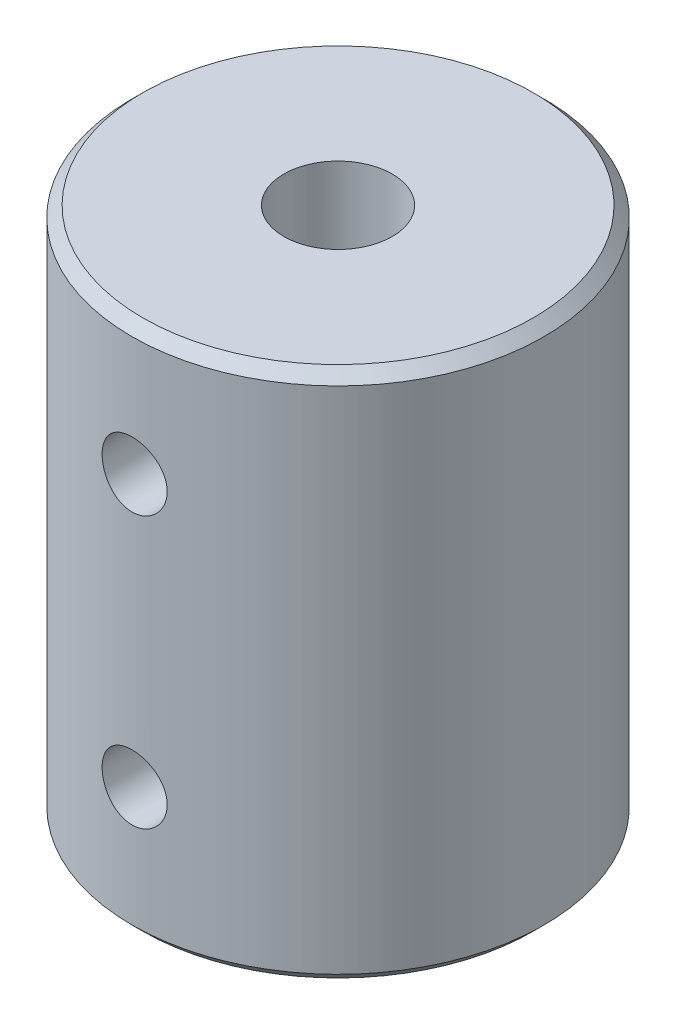
ISO-10303-21;
HEADER;
FILE_DESCRIPTION(('STEP AP214'),'2;1');
FILE_NAME('part.step','',(''),(''),'','','');
FILE_SCHEMA(('AUTOMOTIVE_DESIGN { 1 0 10303 214 1 1 1 1 }'));
ENDSEC;
DATA;
#1=APPLICATION_CONTEXT('core data for automotive mechanical design processes');
#2=APPLICATION_PROTOCOL_DEFINITION('international standard','automotive_design',2000,#1);
#3=PRODUCT_CONTEXT('',#1,'mechanical');
#4=PRODUCT('Part','Part','',(#3));
#5=PRODUCT_RELATED_PRODUCT_CATEGORY('part','',(#4));
#6=PRODUCT_DEFINITION_FORMATION('','',#4);
#7=PRODUCT_DEFINITION_CONTEXT('part definition',#1,'design');
#8=PRODUCT_DEFINITION('design','',#6,#7);
#9=PRODUCT_DEFINITION_SHAPE('','',#8);
#10=(LENGTH_UNIT() NAMED_UNIT(*) SI_UNIT(.MILLI.,.METRE.));
#11=(NAMED_UNIT(*) PLANE_ANGLE_UNIT() SI_UNIT($,.RADIAN.));
#12=(NAMED_UNIT(*) SI_UNIT($,.STERADIAN.) SOLID_ANGLE_UNIT());
#13=UNCERTAINTY_MEASURE_WITH_UNIT(LENGTH_MEASURE(1.E-05),#10,'distance_accuracy_value','');
#14=(GEOMETRIC_REPRESENTATION_CONTEXT(3) GLOBAL_UNCERTAINTY_ASSIGNED_CONTEXT((#13)) GLOBAL_UNIT_ASSIGNED_CONTEXT((#10,
#11,#12)) REPRESENTATION_CONTEXT('',''));
#15=CARTESIAN_POINT('',(0.,0.,0.));
#16=DIRECTION('',(0.,0.,1.));
#17=DIRECTION('',(1.,0.,0.));
#18=AXIS2_PLACEMENT_3D('',#15,#16,#17);
#19=CARTESIAN_POINT('',(0.,24.5,0.));
#20=DIRECTION('',(0.,-1.,0.));
#21=DIRECTION('',(0.,0.,-1.));
#22=AXIS2_PLACEMENT_3D('',#19,#20,#21);
#23=CYLINDRICAL_SURFACE('',#22,2.5);
#24=CARTESIAN_POINT('',(1.5,18.5,2.));
#25=CARTESIAN_POINT('',(1.50000404108592,18.4245210247104,1.99999416642511));
#26=CARTESIAN_POINT('',(1.49426852824014,18.3490615659202,2.00433633903481));
#27=CARTESIAN_POINT('',(1.47174965152787,18.2006760960378,2.02092590613883));
#28=CARTESIAN_POINT('',(1.45495475788936,18.1277528126149,2.03318155043097));
#29=CARTESIAN_POINT('',(1.41143486335796,17.9869163583227,2.0636233903473));
#30=CARTESIAN_POINT('',(1.3847815450315,17.9189711619647,2.08176666183119));
#31=CARTESIAN_POINT('',(1.3225290928302,17.7885625466321,2.12185904995836));
#32=CARTESIAN_POINT('',(1.28692729054694,17.7261007703049,2.14380930122416));
#33=CARTESIAN_POINT('',(1.20271292747644,17.6000509833359,2.19228594587542));
#34=CARTESIAN_POINT('',(1.15304179435289,17.5372590428761,2.21904371037662));
#35=CARTESIAN_POINT('',(1.04426801309985,17.4202352372583,2.27226229431061));
#36=CARTESIAN_POINT('',(0.985158296729613,17.3660098483292,2.29872287517103));
#37=CARTESIAN_POINT('',(0.851442367411701,17.2618661902903,2.35175567858734));
#38=CARTESIAN_POINT('',(0.775851995162548,17.2130455363302,2.37803133577818));
#39=CARTESIAN_POINT('',(0.615654228271659,17.1291902775556,2.42443786983179));
#40=CARTESIAN_POINT('',(0.531055196626331,17.0941430258773,2.44457437988735));
#41=CARTESIAN_POINT('',(0.363771406742667,17.0424040771874,2.4747098780044));
#42=CARTESIAN_POINT('',(0.281674698130916,17.0242796390327,2.4854930393917));
#43=CARTESIAN_POINT('',(0.11497050938271,17.0020571971369,2.49874939277545));
#44=CARTESIAN_POINT('',(0.0303654624001549,16.997946022,2.50123038813307));
#45=CARTESIAN_POINT('',(-0.127637283737309,17.0036137473425,2.49783372711539));
#46=CARTESIAN_POINT('',(-0.201123832865634,17.0117335261693,2.49295437513726));
#47=CARTESIAN_POINT('',(-0.345464269151767,17.0384797956481,2.47707997553857));
#48=CARTESIAN_POINT('',(-0.416317961051201,17.0571070639072,2.46608447529309));
#49=CARTESIAN_POINT('',(-0.554056780469079,17.1041655627038,2.43884907201719));
#50=CARTESIAN_POINT('',(-0.620916491037617,17.132653061139,2.42257910450824));
#51=CARTESIAN_POINT('',(-0.748988660115611,17.1983846162255,2.38609637638748));
#52=CARTESIAN_POINT('',(-0.810199646208011,17.235630947059,2.36588259201812));
#53=CARTESIAN_POINT('',(-0.933074267143199,17.3228390928045,2.32037925976363));
#54=CARTESIAN_POINT('',(-0.993918663198193,17.3737883117357,2.2947718295215));
#55=CARTESIAN_POINT('',(-1.10671465909275,17.4844041178602,2.24255554245601));
#56=CARTESIAN_POINT('',(-1.1586540130834,17.5440825034745,2.21594536703375));
#57=CARTESIAN_POINT('',(-1.25824837767417,17.6786534061636,2.16111075123946));
#58=CARTESIAN_POINT('',(-1.30470933188632,17.7545075765395,2.13305661385124));
#59=CARTESIAN_POINT('',(-1.38397217194232,17.9147062316366,2.08250879557267));
#60=CARTESIAN_POINT('',(-1.41679921962189,17.9990347161256,2.0600049029882));
#61=CARTESIAN_POINT('',(-1.46077497064842,18.1523936318954,2.02895865196731));
#62=CARTESIAN_POINT('',(-1.47527903312665,18.2200406322966,2.01833888618316));
#63=CARTESIAN_POINT('',(-1.49480872755284,18.3573736102995,2.00392150777558));
#64=CARTESIAN_POINT('',(-1.49984538302907,18.4270571204846,2.00011596115116));
#65=CARTESIAN_POINT('',(-1.50014781114183,18.5665516824357,1.99988914321323));
#66=CARTESIAN_POINT('',(-1.49540004697659,18.6363627772152,2.00347810223984));
#67=CARTESIAN_POINT('',(-1.47640290574941,18.7739873437486,2.01751520788652));
#68=CARTESIAN_POINT('',(-1.46214601830139,18.8417991922403,2.02796877613213));
#69=CARTESIAN_POINT('',(-1.42488312618657,18.9737145794798,2.054317683331));
#70=CARTESIAN_POINT('',(-1.40188805257362,19.0378226365322,2.07020622092812));
#71=CARTESIAN_POINT('',(-1.34796261057072,19.1614777157302,2.10571539417587));
#72=CARTESIAN_POINT('',(-1.31702924888212,19.221023006366,2.12533743689999));
#73=CARTESIAN_POINT('',(-1.24167439558512,19.3452400825123,2.17036819177737));
#74=CARTESIAN_POINT('',(-1.19582663060302,19.4089008350966,2.19618239397369));
#75=CARTESIAN_POINT('',(-1.094873955187,19.5282854848495,2.24821754803621));
#76=CARTESIAN_POINT('',(-1.03976018672402,19.5840016921691,2.27443886711455));
#77=CARTESIAN_POINT('',(-0.913274837212761,19.6932240073504,2.32835625910913));
#78=CARTESIAN_POINT('',(-0.840721108780185,19.7455007266058,2.3558007587587));
#79=CARTESIAN_POINT('',(-0.686103100868014,19.8369027768367,2.40537639133459));
#80=CARTESIAN_POINT('',(-0.604045176134696,19.8760368278409,2.42751104449411));
#81=CARTESIAN_POINT('',(-0.438840232972132,19.9368682034314,2.46252280092775));
#82=CARTESIAN_POINT('',(-0.356205963651251,19.9596262277911,2.47595588067329));
#83=CARTESIAN_POINT('',(-0.18738306389085,19.9907146028463,2.494407389061));
#84=CARTESIAN_POINT('',(-0.101198571781962,19.9990612907176,2.49943534582737));
#85=CARTESIAN_POINT('',(0.0598120232009908,20.0006746085859,2.50040600461976));
#86=CARTESIAN_POINT('',(0.134620583589713,19.995803334563,2.49747057186327));
#87=CARTESIAN_POINT('',(0.28214875597878,19.9751061756184,2.48512948412095));
#88=CARTESIAN_POINT('',(0.35486834470192,19.9592801686784,2.47572375706639));
#89=CARTESIAN_POINT('',(0.495145481978802,19.9177804284162,2.45149427526962));
#90=CARTESIAN_POINT('',(0.562767032608834,19.8922684038708,2.43675966858906));
#91=CARTESIAN_POINT('',(0.692781971999988,19.8323594054452,2.40303337447155));
#92=CARTESIAN_POINT('',(0.755174184199837,19.7979604391404,2.38404073252268));
#93=CARTESIAN_POINT('',(0.880263645295952,19.7170748034312,2.3409343265938));
#94=CARTESIAN_POINT('',(0.942258690439945,19.6696812909831,2.31648844639149));
#95=CARTESIAN_POINT('',(1.05789751536307,19.5662469662823,2.26601907350661));
#96=CARTESIAN_POINT('',(1.11153190956916,19.5101965743921,2.23999385274509));
#97=CARTESIAN_POINT('',(1.2159097535057,19.3827144378223,2.18528165666204));
#98=CARTESIAN_POINT('',(1.26542406663368,19.3102335138345,2.15667566270901));
#99=CARTESIAN_POINT('',(1.35156817210325,19.1565151472335,2.10376464485145));
#100=CARTESIAN_POINT('',(1.38820466322661,19.0752822860186,2.07945738811052));
#101=CARTESIAN_POINT('',(1.44437116535132,18.9129357148628,2.0408000304796));
#102=CARTESIAN_POINT('',(1.46509526060188,18.8324047640388,2.02577665830138));
#103=CARTESIAN_POINT('',(1.49289268240426,18.6679026052963,2.00539032320036));
#104=CARTESIAN_POINT('',(1.49999550595837,18.5839392342413,2.00000648744643));
#105=CARTESIAN_POINT('',(1.5,18.5,2.));
#106=B_SPLINE_CURVE_WITH_KNOTS('',3,(#24,#25,#26,#27,#28,#29,#30,#31,#32,#33,#34,#35,#36,#37,
#38,#39,#40,#41,#42,#43,#44,#45,#46,#47,#48,#49,#50,#51,#52,#53,#54,#55,#56,#57,#58,#59,#60,#61,
#62,#63,#64,#65,#66,#67,#68,#69,#70,#71,#72,#73,#74,#75,#76,#77,#78,#79,#80,#81,#82,#83,#84,#85,
#86,#87,#88,#89,#90,#91,#92,#93,#94,#95,#96,#97,#98,#99,#100,#101,#102,#103,#104,#105),
.UNSPECIFIED.,.T.,.F.,(4,2,2,2,2,2,2,2,2,2,2,2,2,2,2,2,2,2,2,2,2,2,2,2,2,2,2,2,2,2,2,2,2,2,2,2,
2,2,2,2,4),(0.,0.226085249493394,0.452406574330771,0.677113624991876,0.90188776221593,
1.15414462390001,1.40659128601844,1.68630157736223,1.9657544327122,2.21853330858497,
2.47107452602766,2.69230130543182,2.91354445887944,3.13607155036377,3.35865648368878,
3.60782810055849,3.85733966656908,4.13576671140277,4.41367760154768,4.62276298054684,
4.83160475643977,5.04073566011181,5.25003193304128,5.45906724365495,5.66818149154662,
5.91499438482003,6.16204457978455,6.44121828011589,6.72020638384848,6.97891479383338,
7.23732973022727,7.461293218494,7.68525920139649,7.90563970188756,8.12606965394585,
8.37042963549488,8.61506198741956,8.89071695766604,9.16622832484806,9.41820120134355,
9.66962780912277),.UNSPECIFIED.);
#107=CARTESIAN_POINT('',(1.5,18.5,2.));
#108=VERTEX_POINT('',#107);
#109=EDGE_CURVE('E71',#108,#108,#106,.T.);
#110=ORIENTED_EDGE('',*,*,#109,.F.);
#111=EDGE_LOOP('',(#110));
#112=FACE_BOUND('',#111,.T.);
#113=CARTESIAN_POINT('',(0.,24.5,0.));
#114=DIRECTION('',(0.,1.,0.));
#115=DIRECTION('',(0.,0.,1.));
#116=AXIS2_PLACEMENT_3D('',#113,#114,#115);
#117=CIRCLE('',#116,2.5);
#118=CARTESIAN_POINT('',(0.,24.5,2.5));
#119=VERTEX_POINT('',#118);
#120=EDGE_CURVE('E61',#119,#119,#117,.T.);
#121=ORIENTED_EDGE('',*,*,#120,.T.);
#122=EDGE_LOOP('',(#121));
#123=FACE_BOUND('',#122,.T.);
#124=CARTESIAN_POINT('',(0.,10.,0.));
#125=DIRECTION('',(0.,-1.,0.));
#126=DIRECTION('',(0.,0.,-1.));
#127=AXIS2_PLACEMENT_3D('',#124,#125,#126);
#128=CIRCLE('',#127,2.5);
#129=CARTESIAN_POINT('',(0.,10.,-2.5));
#130=VERTEX_POINT('',#129);
#131=EDGE_CURVE('E59',#130,#130,#128,.T.);
#132=ORIENTED_EDGE('',*,*,#131,.T.);
#133=EDGE_LOOP('',(#132));
#134=FACE_BOUND('',#133,.T.);
#135=ADVANCED_FACE('F34',(#112,#123,#134),#23,.F.);
#136=CARTESIAN_POINT('',(0.,24.5,0.));
#137=DIRECTION('',(0.,1.,0.));
#138=DIRECTION('',(0.,0.,1.));
#139=AXIS2_PLACEMENT_3D('',#136,#137,#138);
#140=PLANE('',#139);
#141=CARTESIAN_POINT('',(0.,24.5,0.));
#142=DIRECTION('',(0.,1.,0.));
#143=DIRECTION('',(0.,0.,1.));
#144=AXIS2_PLACEMENT_3D('',#141,#142,#143);
#145=CIRCLE('',#144,9.);
#146=CARTESIAN_POINT('',(0.,24.5,9.));
#147=VERTEX_POINT('',#146);
#148=EDGE_CURVE('E46',#147,#147,#145,.T.);
#149=ORIENTED_EDGE('',*,*,#148,.T.);
#150=EDGE_LOOP('',(#149));
#151=FACE_BOUND('',#150,.T.);
#152=ORIENTED_EDGE('',*,*,#120,.F.);
#153=EDGE_LOOP('',(#152));
#154=FACE_BOUND('',#153,.T.);
#155=ADVANCED_FACE('F113',(#151,#154),#140,.T.);
#156=CARTESIAN_POINT('',(0.,0.,0.));
#157=DIRECTION('',(0.,1.,0.));
#158=DIRECTION('',(0.,0.,1.));
#159=AXIS2_PLACEMENT_3D('',#156,#157,#158);
#160=PLANE('',#159);
#161=CARTESIAN_POINT('',(0.,0.,0.));
#162=DIRECTION('',(0.,-1.,0.));
#163=DIRECTION('',(0.,0.,-1.));
#164=AXIS2_PLACEMENT_3D('',#161,#162,#163);
#165=CIRCLE('',#164,4.);
#166=CARTESIAN_POINT('',(0.,0.,-4.));
#167=VERTEX_POINT('',#166);
#168=EDGE_CURVE('E91',#167,#167,#165,.T.);
#169=ORIENTED_EDGE('',*,*,#168,.F.);
#170=EDGE_LOOP('',(#169));
#171=FACE_BOUND('',#170,.T.);
#172=CARTESIAN_POINT('',(0.,0.,0.));
#173=DIRECTION('',(0.,1.,0.));
#174=DIRECTION('',(0.,0.,1.));
#175=AXIS2_PLACEMENT_3D('',#172,#173,#174);
#176=CIRCLE('',#175,8.99999999999999);
#177=CARTESIAN_POINT('',(0.,0.,8.99999999999999));
#178=VERTEX_POINT('',#177);
#179=EDGE_CURVE('E50',#178,#178,#176,.F.);
#180=ORIENTED_EDGE('',*,*,#179,.T.);
#181=EDGE_LOOP('',(#180));
#182=FACE_BOUND('',#181,.T.);
#183=ADVANCED_FACE('F101',(#171,#182),#160,.F.);
#184=CARTESIAN_POINT('',(0.,24.5,0.));
#185=DIRECTION('',(0.,-1.,0.));
#186=DIRECTION('',(0.,0.,-1.));
#187=AXIS2_PLACEMENT_3D('',#184,#185,#186);
#188=CYLINDRICAL_SURFACE('',#187,9.5);
#189=CARTESIAN_POINT('',(1.5,18.5,9.38083151964686));
#190=CARTESIAN_POINT('',(1.49999658455056,18.416309730994,9.38083297404066));
#191=CARTESIAN_POINT('',(1.49297223784084,18.3325722057604,9.38196360092028));
#192=CARTESIAN_POINT('',(1.46507009131938,18.1674421963071,9.38636039550341));
#193=CARTESIAN_POINT('',(1.44417911871311,18.0860520187703,9.38962859377943));
#194=CARTESIAN_POINT('',(1.38918760267279,17.9280306268152,9.39792135372632));
#195=CARTESIAN_POINT('',(1.35509761216466,17.8513956671386,9.40294451195283));
#196=CARTESIAN_POINT('',(1.27470128030859,17.7049430897645,9.414179545352));
#197=CARTESIAN_POINT('',(1.22839647880733,17.6351246142734,9.42039127066217));
#198=CARTESIAN_POINT('',(1.12444713836387,17.5036587559128,9.43336503838525));
#199=CARTESIAN_POINT('',(1.06671563821398,17.4420805156865,9.44013105201471));
#200=CARTESIAN_POINT('',(0.941739545888725,17.3294429254274,9.45341567106039));
#201=CARTESIAN_POINT('',(0.874494412511281,17.2783841742228,9.45993426237471));
#202=CARTESIAN_POINT('',(0.731954548292167,17.1879777440354,9.47203134599669));
#203=CARTESIAN_POINT('',(0.656618750818363,17.1486940570074,9.47760463238817));
#204=CARTESIAN_POINT('',(0.500315336961976,17.0833638343747,9.48713906529767));
#205=CARTESIAN_POINT('',(0.419348049999348,17.0573165252332,9.49110030602129));
#206=CARTESIAN_POINT('',(0.254793214503935,17.0194089321868,9.49693629805995));
#207=CARTESIAN_POINT('',(0.171232996932505,17.0074326731839,9.4988280968723));
#208=CARTESIAN_POINT('',(0.00326909893889466,16.9976467905348,9.5003705446193));
#209=CARTESIAN_POINT('',(-0.0811345294603269,16.999836298441,9.50002133094164));
#210=CARTESIAN_POINT('',(-0.247597304848638,17.0182287718207,9.49713466336618));
#211=CARTESIAN_POINT('',(-0.329670625893897,17.0343069477594,9.49461669627846));
#212=CARTESIAN_POINT('',(-0.489939598315296,17.0798241916706,9.48769715323518));
#213=CARTESIAN_POINT('',(-0.568135141212462,17.1092636331844,9.48329552461823));
#214=CARTESIAN_POINT('',(-0.718803540216119,17.1807937561529,9.47306987014884));
#215=CARTESIAN_POINT('',(-0.791251288178856,17.2229364571255,9.46724001448607));
#216=CARTESIAN_POINT('',(-0.928093849593963,17.3186387835267,9.45480671150477));
#217=CARTESIAN_POINT('',(-0.992488076174234,17.372199240216,9.44820320787719));
#218=CARTESIAN_POINT('',(-1.1121320674923,17.489910476114,9.43487320037046));
#219=CARTESIAN_POINT('',(-1.16727457805414,17.5541702627698,9.42814614020981));
#220=CARTESIAN_POINT('',(-1.26601092962899,17.6910871241671,9.41539709463342));
#221=CARTESIAN_POINT('',(-1.30960468415935,17.7637442617862,9.40937511449785));
#222=CARTESIAN_POINT('',(-1.38402357522716,17.9155109464371,9.39871800561222));
#223=CARTESIAN_POINT('',(-1.41483681797789,17.9946264221589,9.3940841698043));
#224=CARTESIAN_POINT('',(-1.46270749784294,18.1569994205907,9.38675017598398));
#225=CARTESIAN_POINT('',(-1.47976601505946,18.2402566175231,9.38404986614158));
#226=CARTESIAN_POINT('',(-1.49949411042943,18.4075929556588,9.38091773533559));
#227=CARTESIAN_POINT('',(-1.50231612080203,18.4916536912182,9.38046188392375));
#228=CARTESIAN_POINT('',(-1.4938963689811,18.659047058933,9.38180638869071));
#229=CARTESIAN_POINT('',(-1.48265509215639,18.7423797161168,9.38360666700331));
#230=CARTESIAN_POINT('',(-1.44655746438407,18.9054736693627,9.38923845197488));
#231=CARTESIAN_POINT('',(-1.42177781446732,18.9852523717135,9.39305851175888));
#232=CARTESIAN_POINT('',(-1.35938693205191,19.1395243407161,9.40228991972539));
#233=CARTESIAN_POINT('',(-1.3217750034913,19.2140173203894,9.40770135422673));
#234=CARTESIAN_POINT('',(-1.23442398163625,19.356284315317,9.41956203589073));
#235=CARTESIAN_POINT('',(-1.18458667109844,19.4239973256054,9.42601953670219));
#236=CARTESIAN_POINT('',(-1.07433532022963,19.5501534885926,9.43922022959441));
#237=CARTESIAN_POINT('',(-1.01392061491125,19.60859605803,9.44596343961713));
#238=CARTESIAN_POINT('',(-0.883556250112782,19.7151040379333,9.45905128553892));
#239=CARTESIAN_POINT('',(-0.813523322567932,19.7630681337632,9.46539164279549));
#240=CARTESIAN_POINT('',(-0.666305394879822,19.8465500312293,9.47689193046182));
#241=CARTESIAN_POINT('',(-0.589120607345014,19.8820682027044,9.48205189594613));
#242=CARTESIAN_POINT('',(-0.430099180755798,19.939490080176,9.49059133505206));
#243=CARTESIAN_POINT('',(-0.348282544696114,19.9614480818955,9.49397790107197));
#244=CARTESIAN_POINT('',(-0.182065541000525,19.9913016379704,9.49861883842448));
#245=CARTESIAN_POINT('',(-0.097665363749637,19.9991982260071,9.49987336648691));
#246=CARTESIAN_POINT('',(0.070342489056164,20.0006774861194,9.50010700904781));
#247=CARTESIAN_POINT('',(0.15394880985568,19.9944147738016,9.49911070212592));
#248=CARTESIAN_POINT('',(0.318903288593767,19.968086009826,9.49500446266303));
#249=CARTESIAN_POINT('',(0.400251456141505,19.9480200169149,9.4918945391176));
#250=CARTESIAN_POINT('',(0.558330315524414,19.8947112386408,9.48390902705529));
#251=CARTESIAN_POINT('',(0.635065084473798,19.8614802910505,9.47903502511627));
#252=CARTESIAN_POINT('',(0.781893871437118,19.7828017130742,9.46805518209959));
#253=CARTESIAN_POINT('',(0.851987627392474,19.7373536008625,9.46194929244058));
#254=CARTESIAN_POINT('',(0.984326499290175,19.6349767236385,9.44910438099924));
#255=CARTESIAN_POINT('',(1.04648306132952,19.5779342156682,9.44235947063351));
#256=CARTESIAN_POINT('',(1.16039729972464,19.4542269669354,9.42903896923987));
#257=CARTESIAN_POINT('',(1.21215253557012,19.387559974227,9.42246341826431));
#258=CARTESIAN_POINT('',(1.30409009743287,19.2460015685181,9.41018172735959));
#259=CARTESIAN_POINT('',(1.34419772972858,19.171061150686,9.40448130469082));
#260=CARTESIAN_POINT('',(1.41119529560835,19.0154502477483,9.39466254048804));
#261=CARTESIAN_POINT('',(1.43809871074204,18.934785703743,9.39054258623338));
#262=CARTESIAN_POINT('',(1.47193913254666,18.7948171282112,9.38528558640041));
#263=CARTESIAN_POINT('',(1.48244550005068,18.7363700340157,9.38362436450214));
#264=CARTESIAN_POINT('',(1.49647709113171,18.6186231993665,9.38139682399235));
#265=CARTESIAN_POINT('',(1.50000242102603,18.5593234719117,9.38083048870633));
#266=CARTESIAN_POINT('',(1.5,18.5,9.38083151964686));
#267=B_SPLINE_CURVE_WITH_KNOTS('',3,(#189,#190,#191,#192,#193,#194,#195,#196,#197,#198,#199,
#200,#201,#202,#203,#204,#205,#206,#207,#208,#209,#210,#211,#212,#213,#214,#215,#216,#217,#218,
#219,#220,#221,#222,#223,#224,#225,#226,#227,#228,#229,#230,#231,#232,#233,#234,#235,#236,#237,
#238,#239,#240,#241,#242,#243,#244,#245,#246,#247,#248,#249,#250,#251,#252,#253,#254,#255,#256,
#257,#258,#259,#260,#261,#262,#263,#264,#265,#266),.UNSPECIFIED.,.T.,.F.,(4,2,2,2,2,2,2,2,2,2,2,
2,2,2,2,2,2,2,2,2,2,2,2,2,2,2,2,2,2,2,2,2,2,2,2,2,2,2,4),(0.,0.250853927262165,
0.501946498416266,0.752838728320958,1.00369934487581,1.2565480788977,1.50941120251429,
1.76362459165416,2.01782312279828,2.26991148848838,2.52198439977627,2.77181572176523,
3.02165402872708,3.27252964579772,3.52342353390932,3.77705047333307,4.03067931198404,
4.28454365571369,4.53838806257511,4.78950866646251,5.04062060361752,5.29032441173719,
5.54004176670728,5.79183509438419,6.04364425767606,6.29778980620821,6.55192780199649,
6.8050415020287,7.05813659442521,7.30848132386849,7.55882498785123,7.80894405482681,
8.05907298755212,8.31178569360907,8.56455762574338,8.81891644248641,9.07301501496295,
9.25083440456604,9.42865108605878),.UNSPECIFIED.);
#268=CARTESIAN_POINT('',(1.5,18.5,9.38083151964686));
#269=VERTEX_POINT('',#268);
#270=EDGE_CURVE('E10',#269,#269,#267,.T.);
#271=ORIENTED_EDGE('',*,*,#270,.T.);
#272=EDGE_LOOP('',(#271));
#273=FACE_BOUND('',#272,.T.);
#274=CARTESIAN_POINT('',(1.5,6.,9.38083151964686));
#275=CARTESIAN_POINT('',(1.49999658455055,5.91630973099397,9.38083297404066));
#276=CARTESIAN_POINT('',(1.49297223784084,5.83257220576043,9.38196360092028));
#277=CARTESIAN_POINT('',(1.46507009131938,5.66744219630707,9.38636039550341));
#278=CARTESIAN_POINT('',(1.44417911871311,5.58605201877025,9.38962859377943));
#279=CARTESIAN_POINT('',(1.38918760267279,5.42803062681524,9.39792135372632));
#280=CARTESIAN_POINT('',(1.35509761216466,5.35139566713862,9.40294451195283));
#281=CARTESIAN_POINT('',(1.27470128030859,5.20494308976448,9.414179545352));
#282=CARTESIAN_POINT('',(1.22839647880733,5.13512461427336,9.42039127066217));
#283=CARTESIAN_POINT('',(1.12444713836387,5.00365875591277,9.43336503838525));
#284=CARTESIAN_POINT('',(1.06671563821398,4.94208051568652,9.44013105201471));
#285=CARTESIAN_POINT('',(0.941739545888722,4.82944292542735,9.45341567106039));
#286=CARTESIAN_POINT('',(0.874494412511277,4.7783841742228,9.45993426237471));
#287=CARTESIAN_POINT('',(0.731954548292163,4.68797774403544,9.47203134599669));
#288=CARTESIAN_POINT('',(0.656618750818359,4.6486940570074,9.47760463238817));
#289=CARTESIAN_POINT('',(0.500315336961972,4.58336383437469,9.48713906529767));
#290=CARTESIAN_POINT('',(0.419348049999344,4.55731652523315,9.49110030602129));
#291=CARTESIAN_POINT('',(0.254793214503931,4.51940893218676,9.49693629805995));
#292=CARTESIAN_POINT('',(0.171232996932501,4.50743267318387,9.4988280968723));
#293=CARTESIAN_POINT('',(0.00326909893889123,4.49764679053478,9.5003705446193));
#294=CARTESIAN_POINT('',(-0.0811345294603304,4.499836298441,9.50002133094164));
#295=CARTESIAN_POINT('',(-0.247597304848641,4.51822877182066,9.49713466336618));
#296=CARTESIAN_POINT('',(-0.329670625893899,4.53430694775938,9.49461669627846));
#297=CARTESIAN_POINT('',(-0.489939598315299,4.57982419167056,9.48769715323518));
#298=CARTESIAN_POINT('',(-0.568135141212465,4.60926363318438,9.48329552461823));
#299=CARTESIAN_POINT('',(-0.718803540216121,4.68079375615291,9.47306987014884));
#300=CARTESIAN_POINT('',(-0.791251288178858,4.72293645712551,9.46724001448607));
#301=CARTESIAN_POINT('',(-0.928093849593965,4.81863878352674,9.45480671150477));
#302=CARTESIAN_POINT('',(-0.992488076174237,4.87219924021597,9.44820320787719));
#303=CARTESIAN_POINT('',(-1.1121320674923,4.98991047611401,9.43487320037046));
#304=CARTESIAN_POINT('',(-1.16727457805414,5.05417026276977,9.42814614020981));
#305=CARTESIAN_POINT('',(-1.266010929629,5.1910871241671,9.41539709463342));
#306=CARTESIAN_POINT('',(-1.30960468415935,5.26374426178624,9.40937511449785));
#307=CARTESIAN_POINT('',(-1.38402357522716,5.41551094643708,9.39871800561222));
#308=CARTESIAN_POINT('',(-1.4148368179779,5.49462642215888,9.39408416980429));
#309=CARTESIAN_POINT('',(-1.46270749784294,5.65699942059069,9.38675017598398));
#310=CARTESIAN_POINT('',(-1.47976601505946,5.74025661752309,9.38404986614158));
#311=CARTESIAN_POINT('',(-1.49949411042943,5.90759295565885,9.38091773533559));
#312=CARTESIAN_POINT('',(-1.50231612080203,5.99165369121824,9.38046188392375));
#313=CARTESIAN_POINT('',(-1.4938963689811,6.15904705893304,9.38180638869071));
#314=CARTESIAN_POINT('',(-1.48265509215639,6.2423797161168,9.3836066670033));
#315=CARTESIAN_POINT('',(-1.44655746438407,6.40547366936269,9.38923845197488));
#316=CARTESIAN_POINT('',(-1.42177781446732,6.48525237171346,9.39305851175888));
#317=CARTESIAN_POINT('',(-1.35938693205191,6.63952434071612,9.4022899197254));
#318=CARTESIAN_POINT('',(-1.3217750034913,6.71401732038944,9.40770135422673));
#319=CARTESIAN_POINT('',(-1.23442398163625,6.85628431531696,9.41956203589073));
#320=CARTESIAN_POINT('',(-1.18458667109844,6.92399732560537,9.42601953670219));
#321=CARTESIAN_POINT('',(-1.07433532022963,7.05015348859258,9.43922022959441));
#322=CARTESIAN_POINT('',(-1.01392061491125,7.10859605802998,9.44596343961713));
#323=CARTESIAN_POINT('',(-0.883556250112781,7.21510403793332,9.45905128553892));
#324=CARTESIAN_POINT('',(-0.81352332256793,7.26306813376324,9.46539164279549));
#325=CARTESIAN_POINT('',(-0.666305394879819,7.34655003122935,9.47689193046182));
#326=CARTESIAN_POINT('',(-0.58912060734501,7.38206820270442,9.48205189594613));
#327=CARTESIAN_POINT('',(-0.430099180755794,7.43949008017602,9.49059133505206));
#328=CARTESIAN_POINT('',(-0.34828254469611,7.46144808189547,9.49397790107197));
#329=CARTESIAN_POINT('',(-0.182065541000522,7.49130163797043,9.49861883842448));
#330=CARTESIAN_POINT('',(-0.0976653637496341,7.4991982260071,9.49987336648691));
#331=CARTESIAN_POINT('',(0.0703424890561666,7.50067748611935,9.50010700904781));
#332=CARTESIAN_POINT('',(0.153948809855683,7.49441477380159,9.49911070212592));
#333=CARTESIAN_POINT('',(0.31890328859377,7.468086009826,9.49500446266303));
#334=CARTESIAN_POINT('',(0.400251456141508,7.44802001691492,9.4918945391176));
#335=CARTESIAN_POINT('',(0.558330315524417,7.39471123864075,9.48390902705529));
#336=CARTESIAN_POINT('',(0.6350650844738,7.36148029105045,9.47903502511627));
#337=CARTESIAN_POINT('',(0.78189387143712,7.28280171307417,9.46805518209959));
#338=CARTESIAN_POINT('',(0.851987627392476,7.23735360086246,9.46194929244058));
#339=CARTESIAN_POINT('',(0.984326499290177,7.13497672363849,9.44910438099924));
#340=CARTESIAN_POINT('',(1.04648306132953,7.07793421566818,9.44235947063351));
#341=CARTESIAN_POINT('',(1.16039729972464,6.95422696693538,9.42903896923987));
#342=CARTESIAN_POINT('',(1.21215253557012,6.887559974227,9.42246341826431));
#343=CARTESIAN_POINT('',(1.30409009743288,6.74600156851814,9.41018172735959));
#344=CARTESIAN_POINT('',(1.34419772972858,6.67106115068598,9.40448130469082));
#345=CARTESIAN_POINT('',(1.41119529560835,6.51545024774828,9.39466254048804));
#346=CARTESIAN_POINT('',(1.43809871074204,6.43478570374299,9.39054258623338));
#347=CARTESIAN_POINT('',(1.47193913254666,6.29481712821115,9.38528558640041));
#348=CARTESIAN_POINT('',(1.48244550005068,6.23637003401573,9.38362436450214));
#349=CARTESIAN_POINT('',(1.49647709113171,6.11862319936654,9.38139682399235));
#350=CARTESIAN_POINT('',(1.50000242102602,6.05932347191174,9.38083048870633));
#351=CARTESIAN_POINT('',(1.5,6.,9.38083151964686));
#352=B_SPLINE_CURVE_WITH_KNOTS('',3,(#274,#275,#276,#277,#278,#279,#280,#281,#282,#283,#284,
#285,#286,#287,#288,#289,#290,#291,#292,#293,#294,#295,#296,#297,#298,#299,#300,#301,#302,#303,
#304,#305,#306,#307,#308,#309,#310,#311,#312,#313,#314,#315,#316,#317,#318,#319,#320,#321,#322,
#323,#324,#325,#326,#327,#328,#329,#330,#331,#332,#333,#334,#335,#336,#337,#338,#339,#340,#341,
#342,#343,#344,#345,#346,#347,#348,#349,#350,#351),.UNSPECIFIED.,.T.,.F.,(4,2,2,2,2,2,2,2,2,2,2,
2,2,2,2,2,2,2,2,2,2,2,2,2,2,2,2,2,2,2,2,2,2,2,2,2,2,2,4),(0.,0.250853927262166,
0.501946498416268,0.752838728320958,1.00369934487581,1.2565480788977,1.50941120251429,
1.76362459165417,2.01782312279828,2.26991148848838,2.52198439977627,2.77181572176523,
3.02165402872708,3.27252964579772,3.52342353390932,3.77705047333307,4.03067931198404,
4.2845436557137,4.53838806257511,4.78950866646251,5.04062060361752,5.29032441173719,
5.54004176670728,5.79183509438419,6.04364425767606,6.29778980620821,6.55192780199649,
6.8050415020287,7.05813659442521,7.30848132386849,7.55882498785123,7.80894405482681,
8.05907298755212,8.31178569360908,8.56455762574338,8.81891644248641,9.07301501496295,
9.25083440456604,9.42865108605878),.UNSPECIFIED.);
#353=CARTESIAN_POINT('',(1.5,6.,9.38083151964686));
#354=VERTEX_POINT('',#353);
#355=EDGE_CURVE('E70',#354,#354,#352,.T.);
#356=ORIENTED_EDGE('',*,*,#355,.T.);
#357=EDGE_LOOP('',(#356));
#358=FACE_BOUND('',#357,.T.);
#359=CARTESIAN_POINT('',(0.,0.5,0.));
#360=DIRECTION('',(0.,1.,0.));
#361=DIRECTION('',(0.,0.,1.));
#362=AXIS2_PLACEMENT_3D('',#359,#360,#361);
#363=CIRCLE('',#362,9.5);
#364=CARTESIAN_POINT('',(0.,0.5,9.5));
#365=VERTEX_POINT('',#364);
#366=EDGE_CURVE('E55',#365,#365,#363,.T.);
#367=ORIENTED_EDGE('',*,*,#366,.T.);
#368=EDGE_LOOP('',(#367));
#369=FACE_BOUND('',#368,.T.);
#370=CARTESIAN_POINT('',(0.,24.,0.));
#371=DIRECTION('',(0.,1.,0.));
#372=DIRECTION('',(0.,0.,1.));
#373=AXIS2_PLACEMENT_3D('',#370,#371,#372);
#374=CIRCLE('',#373,9.5);
#375=CARTESIAN_POINT('',(0.,24.,9.5));
#376=VERTEX_POINT('',#375);
#377=EDGE_CURVE('E137',#376,#376,#374,.F.);
#378=ORIENTED_EDGE('',*,*,#377,.T.);
#379=EDGE_LOOP('',(#378));
#380=FACE_BOUND('',#379,.T.);
#381=ADVANCED_FACE('F96',(#273,#358,#369,#380),#188,.T.);
#382=CARTESIAN_POINT('',(0.,0.5,0.));
#383=DIRECTION('',(0.,1.,0.));
#384=DIRECTION('',(0.,0.,1.));
#385=AXIS2_PLACEMENT_3D('',#382,#383,#384);
#386=CONICAL_SURFACE('',#385,9.5,0.785398163397452);
#387=ORIENTED_EDGE('',*,*,#179,.F.);
#388=EDGE_LOOP('',(#387));
#389=FACE_BOUND('',#388,.T.);
#390=ORIENTED_EDGE('',*,*,#366,.F.);
#391=EDGE_LOOP('',(#390));
#392=FACE_BOUND('',#391,.T.);
#393=ADVANCED_FACE('F100',(#389,#392),#386,.T.);
#394=CARTESIAN_POINT('',(0.,24.5,0.));
#395=DIRECTION('',(0.,-1.,0.));
#396=DIRECTION('',(0.,0.,-1.));
#397=AXIS2_PLACEMENT_3D('',#394,#395,#396);
#398=CONICAL_SURFACE('',#397,9.,0.785398163397448);
#399=ORIENTED_EDGE('',*,*,#377,.F.);
#400=EDGE_LOOP('',(#399));
#401=FACE_BOUND('',#400,.T.);
#402=ORIENTED_EDGE('',*,*,#148,.F.);
#403=EDGE_LOOP('',(#402));
#404=FACE_BOUND('',#403,.T.);
#405=ADVANCED_FACE('F36',(#401,#404),#398,.T.);
#406=CARTESIAN_POINT('',(0.,10.,0.));
#407=DIRECTION('',(0.,-1.,0.));
#408=DIRECTION('',(0.,0.,-1.));
#409=AXIS2_PLACEMENT_3D('',#406,#407,#408);
#410=CYLINDRICAL_SURFACE('',#409,4.);
#411=CARTESIAN_POINT('',(1.5,6.,3.70809924354783));
#412=CARTESIAN_POINT('',(1.50000304106109,6.08100748372079,3.70809640633806));
#413=CARTESIAN_POINT('',(1.49341597549487,6.16199492250364,3.71078260240986));
#414=CARTESIAN_POINT('',(1.46736187895468,6.3215280829132,3.72116159304967));
#415=CARTESIAN_POINT('',(1.44789523373263,6.40007387759501,3.72885423767112));
#416=CARTESIAN_POINT('',(1.39689657610574,6.55237537161353,3.748254802809));
#417=CARTESIAN_POINT('',(1.36539347266348,6.62614205665108,3.7599530956926));
#418=CARTESIAN_POINT('',(1.29131856742698,6.76737189681884,3.78603134206598));
#419=CARTESIAN_POINT('',(1.24874344095039,6.83483315028252,3.80041210067323));
#420=CARTESIAN_POINT('',(1.15146661374162,6.96489031162282,3.83103574665713));
#421=CARTESIAN_POINT('',(1.09630381213306,7.02712852962939,3.84733341923603));
#422=CARTESIAN_POINT('',(0.976395839778926,7.14172281467149,3.87949750628547));
#423=CARTESIAN_POINT('',(0.911648630256679,7.19407677374186,3.89536382814785));
#424=CARTESIAN_POINT('',(0.7716946551776,7.28913951229561,3.92552873936553));
#425=CARTESIAN_POINT('',(0.696206947538027,7.33145947471586,3.93975561223505));
#426=CARTESIAN_POINT('',(0.538555771965246,7.40265117252491,3.96438007973848));
#427=CARTESIAN_POINT('',(0.456394630933535,7.43152757199197,3.97477900217006));
#428=CARTESIAN_POINT('',(0.291489341676831,7.47375789577462,3.9901869710344));
#429=CARTESIAN_POINT('',(0.208923197281595,7.48772762744046,3.99540915214774));
#430=CARTESIAN_POINT('',(0.0424643637947851,7.50172120094499,4.0006401410794));
#431=CARTESIAN_POINT('',(-0.0414278850628339,7.50174957761871,4.00065064414902));
#432=CARTESIAN_POINT('',(-0.203743543064477,7.48821823853483,3.99559265903894));
#433=CARTESIAN_POINT('',(-0.282232178266901,7.47533070205118,3.99077541996683));
#434=CARTESIAN_POINT('',(-0.435839217984392,7.43746408477445,3.97693274932263));
#435=CARTESIAN_POINT('',(-0.510957383430299,7.41248414773796,3.96790701975577));
#436=CARTESIAN_POINT('',(-0.656989017303105,7.35082954832415,3.94637769167531));
#437=CARTESIAN_POINT('',(-0.72782539228731,7.31398999473159,3.93382539470077));
#438=CARTESIAN_POINT('',(-0.86248660795756,7.22980790307061,3.90651310225279));
#439=CARTESIAN_POINT('',(-0.926309176932324,7.1824619769824,3.8917523951284));
#440=CARTESIAN_POINT('',(-1.04909048680094,7.07537271371681,3.86052529655816));
#441=CARTESIAN_POINT('',(-1.10754614526348,7.01506608434957,3.84400963763883));
#442=CARTESIAN_POINT('',(-1.21370395569342,6.88540700667844,3.81182460645722));
#443=CARTESIAN_POINT('',(-1.261403406929,6.81605229341336,3.79615544748847));
#444=CARTESIAN_POINT('',(-1.34565611808152,6.66828053253718,3.76712703500335));
#445=CARTESIAN_POINT('',(-1.38193847851831,6.58969650631393,3.75382677150277));
#446=CARTESIAN_POINT('',(-1.44056464441501,6.42690377483243,3.73172438629002));
#447=CARTESIAN_POINT('',(-1.46291620605595,6.34269822840631,3.72291976205783));
#448=CARTESIAN_POINT('',(-1.49190191709668,6.17602403768404,3.71139597222848));
#449=CARTESIAN_POINT('',(-1.49933521158966,6.09371589446386,3.70836785241537));
#450=CARTESIAN_POINT('',(-1.50057885636272,5.92899064325826,3.70786539525016));
#451=CARTESIAN_POINT('',(-1.49439261093762,5.84657356764753,3.71038967003987));
#452=CARTESIAN_POINT('',(-1.46929733520157,5.68807007771232,3.72039381629735));
#453=CARTESIAN_POINT('',(-1.45100618334224,5.61186886423534,3.72763276216449));
#454=CARTESIAN_POINT('',(-1.40299774640637,5.4636520552798,3.74596487046362));
#455=CARTESIAN_POINT('',(-1.37327812034623,5.39163732083186,3.75705882250173));
#456=CARTESIAN_POINT('',(-1.30200292275278,5.25083556192379,3.7823624311608));
#457=CARTESIAN_POINT('',(-1.26004545177047,5.18227070786266,3.79667328892065));
#458=CARTESIAN_POINT('',(-1.16591317862479,5.05287101827396,3.82662814294291));
#459=CARTESIAN_POINT('',(-1.11373463696435,4.99203902537537,3.84227262594077));
#460=CARTESIAN_POINT('',(-0.996727340900937,4.8758316268049,3.87433046553184));
#461=CARTESIAN_POINT('',(-0.931306341491061,4.82104659123125,3.89072969357028));
#462=CARTESIAN_POINT('',(-0.79179747175315,4.72316163241056,3.92149874963302));
#463=CARTESIAN_POINT('',(-0.717709573322672,4.68006174705416,3.93586857107664));
#464=CARTESIAN_POINT('',(-0.563016329468475,4.60705394380039,3.96094985704552));
#465=CARTESIAN_POINT('',(-0.482434433064625,4.5771008762074,3.9716738133801));
#466=CARTESIAN_POINT('',(-0.316881887523253,4.53134358615008,3.98829436712571));
#467=CARTESIAN_POINT('',(-0.231913320723591,4.5155327145776,3.99419323299413));
#468=CARTESIAN_POINT('',(-0.0653355852738143,4.49922559724517,4.00028407317073));
#469=CARTESIAN_POINT('',(0.0161807680608465,4.49789051694101,4.00078860953764));
#470=CARTESIAN_POINT('',(0.178226786412425,4.50841515944539,3.99684889809223));
#471=CARTESIAN_POINT('',(0.258756569245258,4.52027329088586,3.9924052471313));
#472=CARTESIAN_POINT('',(0.414548248377127,4.55625885149362,3.97921089603771));
#473=CARTESIAN_POINT('',(0.489890731068836,4.58007990587836,3.97056791378017));
#474=CARTESIAN_POINT('',(0.635515473006391,4.63901001338436,3.9498778362099));
#475=CARTESIAN_POINT('',(0.705796771275544,4.67412120330475,3.93783009655664));
#476=CARTESIAN_POINT('',(0.842540176994414,4.75631394350481,3.91090618300074));
#477=CARTESIAN_POINT('',(0.908717548846851,4.80383664051415,3.89593240108828));
#478=CARTESIAN_POINT('',(1.03241734752336,4.90880783018761,3.86499507694844));
#479=CARTESIAN_POINT('',(1.0899366712559,4.96625986580788,3.84903118274027));
#480=CARTESIAN_POINT('',(1.19781214236196,5.09306413164506,3.81688129739175));
#481=CARTESIAN_POINT('',(1.24762999816025,5.16288440215431,3.8007280534916));
#482=CARTESIAN_POINT('',(1.33484709556843,5.31041586957333,3.77098325003638));
#483=CARTESIAN_POINT('',(1.37224504878157,5.38812788405348,3.75739195631216));
#484=CARTESIAN_POINT('',(1.4346588697426,5.55295568097541,3.73402269853266));
#485=CARTESIAN_POINT('',(1.45906002899523,5.64033436651179,3.7244380329086));
#486=CARTESIAN_POINT('',(1.49172356722079,5.81848527195579,3.71147994336315));
#487=CARTESIAN_POINT('',(1.49999659339571,5.90925521270999,3.70810242179736));
#488=CARTESIAN_POINT('',(1.5,6.,3.70809924354783));
#489=B_SPLINE_CURVE_WITH_KNOTS('',3,(#411,#412,#413,#414,#415,#416,#417,#418,#419,#420,#421,
#422,#423,#424,#425,#426,#427,#428,#429,#430,#431,#432,#433,#434,#435,#436,#437,#438,#439,#440,
#441,#442,#443,#444,#445,#446,#447,#448,#449,#450,#451,#452,#453,#454,#455,#456,#457,#458,#459,
#460,#461,#462,#463,#464,#465,#466,#467,#468,#469,#470,#471,#472,#473,#474,#475,#476,#477,#478,
#479,#480,#481,#482,#483,#484,#485,#486,#487,#488),.UNSPECIFIED.,.T.,.F.,(4,2,2,2,2,2,2,2,2,2,2,
2,2,2,2,2,2,2,2,2,2,2,2,2,2,2,2,2,2,2,2,2,2,2,2,2,2,2,4),(0.,0.242684541416169,
0.485361814598855,0.727459856757031,0.969630679682934,1.22274652401128,1.47591628822983,
1.73770072136421,1.9993942638133,2.24980018489679,2.50012465404857,2.73806472803194,
2.97602165263335,3.21744131210668,3.45893893628976,3.71456675065875,3.97025867827335,
4.23162592252967,4.49284751635474,4.73965657740485,4.98640395388885,5.22143845928199,
5.45652113429526,5.70041561005821,5.94439948466355,6.20385016993624,6.46330169650178,
6.72185508890168,6.98028685560127,7.22365720549936,7.4669982031948,7.70440274003891,
7.94185223512831,8.18928323676987,8.43680270894965,8.69738599542079,8.95799630544243,
9.23003178870926,9.50188762323053),.UNSPECIFIED.);
#490=CARTESIAN_POINT('',(1.5,6.,3.70809924354783));
#491=VERTEX_POINT('',#490);
#492=EDGE_CURVE('E63',#491,#491,#489,.T.);
#493=ORIENTED_EDGE('',*,*,#492,.T.);
#494=EDGE_LOOP('',(#493));
#495=FACE_BOUND('',#494,.T.);
#496=CARTESIAN_POINT('',(0.,10.,0.));
#497=DIRECTION('',(0.,-1.,0.));
#498=DIRECTION('',(0.,0.,-1.));
#499=AXIS2_PLACEMENT_3D('',#496,#497,#498);
#500=CIRCLE('',#499,4.);
#501=CARTESIAN_POINT('',(0.,10.,-4.));
#502=VERTEX_POINT('',#501);
#503=EDGE_CURVE('E62',#502,#502,#500,.T.);
#504=ORIENTED_EDGE('',*,*,#503,.F.);
#505=EDGE_LOOP('',(#504));
#506=FACE_BOUND('',#505,.T.);
#507=ORIENTED_EDGE('',*,*,#168,.T.);
#508=EDGE_LOOP('',(#507));
#509=FACE_BOUND('',#508,.T.);
#510=ADVANCED_FACE('F72',(#495,#506,#509),#410,.F.);
#511=CARTESIAN_POINT('',(0.,10.,0.));
#512=DIRECTION('',(0.,-1.,0.));
#513=DIRECTION('',(0.,0.,-1.));
#514=AXIS2_PLACEMENT_3D('',#511,#512,#513);
#515=PLANE('',#514);
#516=ORIENTED_EDGE('',*,*,#131,.F.);
#517=EDGE_LOOP('',(#516));
#518=FACE_BOUND('',#517,.T.);
#519=ORIENTED_EDGE('',*,*,#503,.T.);
#520=EDGE_LOOP('',(#519));
#521=FACE_BOUND('',#520,.T.);
#522=ADVANCED_FACE('F80',(#518,#521),#515,.T.);
#523=CARTESIAN_POINT('',(0.,6.,-0.5));
#524=DIRECTION('',(0.,0.,1.));
#525=DIRECTION('',(1.,0.,0.));
#526=AXIS2_PLACEMENT_3D('',#523,#524,#525);
#527=CYLINDRICAL_SURFACE('',#526,1.5);
#528=ORIENTED_EDGE('',*,*,#492,.F.);
#529=EDGE_LOOP('',(#528));
#530=FACE_BOUND('',#529,.T.);
#531=ORIENTED_EDGE('',*,*,#355,.F.);
#532=EDGE_LOOP('',(#531));
#533=FACE_BOUND('',#532,.T.);
#534=ADVANCED_FACE('F76',(#530,#533),#527,.F.);
#535=CARTESIAN_POINT('',(0.,18.5,-0.5));
#536=DIRECTION('',(0.,0.,1.));
#537=DIRECTION('',(1.,0.,0.));
#538=AXIS2_PLACEMENT_3D('',#535,#536,#537);
#539=CYLINDRICAL_SURFACE('',#538,1.5);
#540=ORIENTED_EDGE('',*,*,#109,.T.);
#541=EDGE_LOOP('',(#540));
#542=FACE_BOUND('',#541,.T.);
#543=ORIENTED_EDGE('',*,*,#270,.F.);
#544=EDGE_LOOP('',(#543));
#545=FACE_BOUND('',#544,.T.);
#546=ADVANCED_FACE('F79',(#542,#545),#539,.F.);
#547=CLOSED_SHELL('',(#135,#155,#183,#381,#393,#405,#510,#522,#534,#546));
#548=MANIFOLD_SOLID_BREP('B2',#547);
#549=ADVANCED_BREP_SHAPE_REPRESENTATION('',(#18,#548),#14);
#550=SHAPE_DEFINITION_REPRESENTATION(#9,#549);
ENDSEC;
END-ISO-10303-21;
